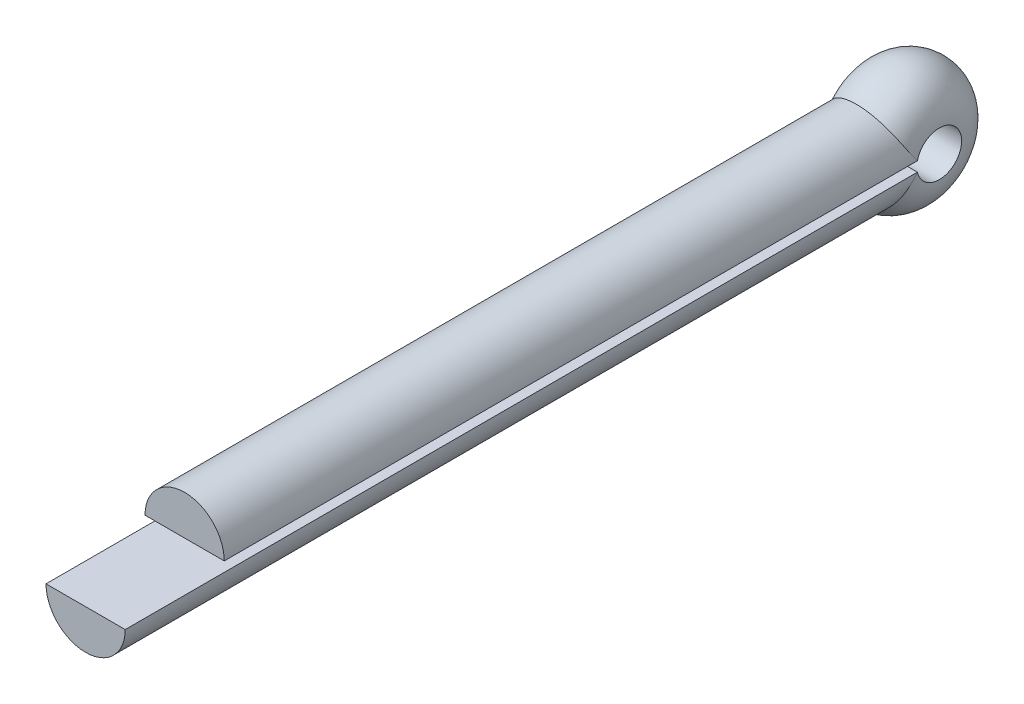
ISO-10303-21;
HEADER;
FILE_DESCRIPTION(('STEP AP214'),'2;1');
FILE_NAME('part.step','',(''),(''),'','','');
FILE_SCHEMA(('AUTOMOTIVE_DESIGN { 1 0 10303 214 1 1 1 1 }'));
ENDSEC;
DATA;
#1=APPLICATION_CONTEXT('core data for automotive mechanical design processes');
#2=APPLICATION_PROTOCOL_DEFINITION('international standard','automotive_design',2000,#1);
#3=PRODUCT_CONTEXT('',#1,'mechanical');
#4=PRODUCT('Part','Part','',(#3));
#5=PRODUCT_RELATED_PRODUCT_CATEGORY('part','',(#4));
#6=PRODUCT_DEFINITION_FORMATION('','',#4);
#7=PRODUCT_DEFINITION_CONTEXT('part definition',#1,'design');
#8=PRODUCT_DEFINITION('design','',#6,#7);
#9=PRODUCT_DEFINITION_SHAPE('','',#8);
#10=(LENGTH_UNIT() NAMED_UNIT(*) SI_UNIT(.MILLI.,.METRE.));
#11=(NAMED_UNIT(*) PLANE_ANGLE_UNIT() SI_UNIT($,.RADIAN.));
#12=(NAMED_UNIT(*) SI_UNIT($,.STERADIAN.) SOLID_ANGLE_UNIT());
#13=UNCERTAINTY_MEASURE_WITH_UNIT(LENGTH_MEASURE(1.E-05),#10,'distance_accuracy_value','');
#14=(GEOMETRIC_REPRESENTATION_CONTEXT(3) GLOBAL_UNCERTAINTY_ASSIGNED_CONTEXT((#13)) GLOBAL_UNIT_ASSIGNED_CONTEXT((#10,
#11,#12)) REPRESENTATION_CONTEXT('',''));
#15=CARTESIAN_POINT('',(0.,0.,0.));
#16=DIRECTION('',(0.,0.,1.));
#17=DIRECTION('',(1.,0.,0.));
#18=AXIS2_PLACEMENT_3D('',#15,#16,#17);
#19=CARTESIAN_POINT('',(2.,0.499999999999996,-5.));
#20=DIRECTION('',(0.,0.,-1.));
#21=DIRECTION('',(1.,0.,0.));
#22=AXIS2_PLACEMENT_3D('',#19,#20,#21);
#23=PLANE('',#22);
#24=CARTESIAN_POINT('',(2.,0.499999999999996,-5.));
#25=DIRECTION('',(0.,0.,-1.));
#26=DIRECTION('',(1.,0.,0.));
#27=AXIS2_PLACEMENT_3D('',#24,#25,#26);
#28=CIRCLE('',#27,2.);
#29=CARTESIAN_POINT('',(0.,0.499999999999996,-5.));
#30=VERTEX_POINT('',#29);
#31=CARTESIAN_POINT('',(4.,0.499999999999995,-5.));
#32=VERTEX_POINT('',#31);
#33=EDGE_CURVE('E79',#30,#32,#28,.T.);
#34=ORIENTED_EDGE('',*,*,#33,.F.);
#35=DIRECTION('',(-1.,0.,0.));
#36=VECTOR('',#35,1.);
#37=CARTESIAN_POINT('',(0.,0.499999999999996,-5.));
#38=LINE('',#37,#36);
#39=EDGE_CURVE('E85',#32,#30,#38,.T.);
#40=ORIENTED_EDGE('',*,*,#39,.F.);
#41=EDGE_LOOP('',(#34,#40));
#42=FACE_BOUND('',#41,.T.);
#43=ADVANCED_FACE('F39',(#42),#23,.F.);
#44=CARTESIAN_POINT('',(2.,0.,0.));
#45=DIRECTION('',(0.,0.,1.));
#46=DIRECTION('',(1.,0.,0.));
#47=AXIS2_PLACEMENT_3D('',#44,#45,#46);
#48=PLANE('',#47);
#49=CARTESIAN_POINT('',(2.,0.,0.));
#50=DIRECTION('',(0.,0.,1.));
#51=DIRECTION('',(1.,0.,0.));
#52=AXIS2_PLACEMENT_3D('',#49,#50,#51);
#53=CIRCLE('',#52,2.);
#54=CARTESIAN_POINT('',(0.,0.,0.));
#55=VERTEX_POINT('',#54);
#56=CARTESIAN_POINT('',(4.,0.,0.));
#57=VERTEX_POINT('',#56);
#58=EDGE_CURVE('E201',#55,#57,#53,.T.);
#59=ORIENTED_EDGE('',*,*,#58,.T.);
#60=DIRECTION('',(-1.,0.,0.));
#61=VECTOR('',#60,1.);
#62=CARTESIAN_POINT('',(0.,0.,0.));
#63=LINE('',#62,#61);
#64=EDGE_CURVE('E165',#57,#55,#63,.T.);
#65=ORIENTED_EDGE('',*,*,#64,.T.);
#66=EDGE_LOOP('',(#59,#65));
#67=FACE_BOUND('',#66,.T.);
#68=ADVANCED_FACE('F230',(#67),#48,.T.);
#69=CARTESIAN_POINT('',(0.,0.5,-40.));
#70=DIRECTION('',(0.,1.,0.));
#71=DIRECTION('',(-1.,0.,0.));
#72=AXIS2_PLACEMENT_3D('',#69,#70,#71);
#73=PLANE('',#72);
#74=ORIENTED_EDGE('',*,*,#39,.T.);
#75=DIRECTION('',(0.,0.,1.));
#76=VECTOR('',#75,1.);
#77=CARTESIAN_POINT('',(0.,0.5,-40.));
#78=LINE('',#77,#76);
#79=CARTESIAN_POINT('',(0.,0.500000000000001,-40.));
#80=VERTEX_POINT('',#79);
#81=EDGE_CURVE('E42',#80,#30,#78,.T.);
#82=ORIENTED_EDGE('',*,*,#81,.F.);
#83=DIRECTION('',(-1.,0.,0.));
#84=VECTOR('',#83,1.);
#85=CARTESIAN_POINT('',(0.,0.500000000000001,-40.));
#86=LINE('',#85,#84);
#87=CARTESIAN_POINT('',(4.,0.5,-40.));
#88=VERTEX_POINT('',#87);
#89=EDGE_CURVE('E316',#88,#80,#86,.T.);
#90=ORIENTED_EDGE('',*,*,#89,.F.);
#91=DIRECTION('',(0.,0.,1.));
#92=VECTOR('',#91,1.);
#93=CARTESIAN_POINT('',(4.,0.5,-40.));
#94=LINE('',#93,#92);
#95=EDGE_CURVE('E90',#88,#32,#94,.T.);
#96=ORIENTED_EDGE('',*,*,#95,.T.);
#97=EDGE_LOOP('',(#74,#82,#90,#96));
#98=FACE_BOUND('',#97,.T.);
#99=ADVANCED_FACE('F86',(#98),#73,.F.);
#100=CARTESIAN_POINT('',(2.,0.5,-40.));
#101=DIRECTION('',(0.,0.,1.));
#102=DIRECTION('',(0.,-1.,0.));
#103=AXIS2_PLACEMENT_3D('',#100,#101,#102);
#104=CYLINDRICAL_SURFACE('',#103,2.);
#105=CARTESIAN_POINT('',(4.00000000000001,0.5,-40.));
#106=CARTESIAN_POINT('',(4.00000001737641,0.50235930064121,-39.998116277382));
#107=CARTESIAN_POINT('',(3.99999584125193,0.50472100075454,-39.9962354554166));
#108=CARTESIAN_POINT('',(3.99979768909097,0.560549155961569,-39.9518874320501));
#109=CARTESIAN_POINT('',(3.99745230429938,0.615220670388856,-39.9108959064395));
#110=CARTESIAN_POINT('',(3.9879566197522,0.726123313404272,-39.8316156157743));
#111=CARTESIAN_POINT('',(3.98080282014764,0.782355549376291,-39.7933288418458));
#112=CARTESIAN_POINT('',(3.96130149805432,0.895739980505567,-39.7192029156661));
#113=CARTESIAN_POINT('',(3.94894164767086,0.952894047573682,-39.6833698093758));
#114=CARTESIAN_POINT('',(3.91878424346007,1.06725125484974,-39.6141431120719));
#115=CARTESIAN_POINT('',(3.90098471330889,1.12445440534574,-39.5807504131709));
#116=CARTESIAN_POINT('',(3.83940415985507,1.29434980457497,-39.4845398723859));
#117=CARTESIAN_POINT('',(3.78730959248784,1.40614429404178,-39.425171394803));
#118=CARTESIAN_POINT('',(3.66082098556796,1.62126674112721,-39.3158838961426));
#119=CARTESIAN_POINT('',(3.58645210283804,1.72460408356439,-39.2659543179089));
#120=CARTESIAN_POINT('',(3.42470682034057,1.90846708329025,-39.1799803398445));
#121=CARTESIAN_POINT('',(3.33918689553033,1.99022093684487,-39.1430758506448));
#122=CARTESIAN_POINT('',(3.15304685574089,2.1384802230446,-39.0775973535078));
#123=CARTESIAN_POINT('',(3.05243404332565,2.2049929908354,-39.0490193364461));
#124=CARTESIAN_POINT('',(2.84863112361413,2.31439070393815,-39.0026953723288));
#125=CARTESIAN_POINT('',(2.74644361944173,2.35883785380443,-38.9842184694793));
#126=CARTESIAN_POINT('',(2.5351334438754,2.43029928304946,-38.9547426741426));
#127=CARTESIAN_POINT('',(2.42601351356411,2.45732040613385,-38.943740845886));
#128=CARTESIAN_POINT('',(2.21034416837075,2.49174088821883,-38.9297600702808));
#129=CARTESIAN_POINT('',(2.10397712352208,2.50012641500501,-38.9263777648115));
#130=CARTESIAN_POINT('',(1.89127468338918,2.49987076704076,-38.9264809355655));
#131=CARTESIAN_POINT('',(1.78493928575903,2.49123227671846,-38.9299653290149));
#132=CARTESIAN_POINT('',(1.5773876413178,2.45761272176371,-38.9436234777712));
#133=CARTESIAN_POINT('',(1.4761129119125,2.43293939697734,-38.9536712865548));
#134=CARTESIAN_POINT('',(1.27937531342037,2.36853274454427,-38.9802051628562));
#135=CARTESIAN_POINT('',(1.18391257411817,2.3287990807358,-38.9966913740858));
#136=CARTESIAN_POINT('',(0.999839654507179,2.23508173972658,-39.0362145539767));
#137=CARTESIAN_POINT('',(0.911356881738371,2.18088904991368,-39.059348023874));
#138=CARTESIAN_POINT('',(0.744980894110577,2.06059940146542,-39.1118210939124));
#139=CARTESIAN_POINT('',(0.667089021883104,1.99450093597357,-39.1411614797148));
#140=CARTESIAN_POINT('',(0.520128044506417,1.8494880821334,-39.2073034726506));
#141=CARTESIAN_POINT('',(0.451630742007957,1.77012354760715,-39.2443865498242));
#142=CARTESIAN_POINT('',(0.329012712335361,1.6038485326822,-39.3248658241418));
#143=CARTESIAN_POINT('',(0.274898012913261,1.5169349086413,-39.3682646564654));
#144=CARTESIAN_POINT('',(0.178080187596662,1.33203531102402,-39.4646629855028));
#145=CARTESIAN_POINT('',(0.136507639193982,1.2337050036898,-39.5181335941322));
#146=CARTESIAN_POINT('',(0.0702321611518915,1.0356164973431,-39.6322644950388));
#147=CARTESIAN_POINT('',(0.045521862333216,0.935858941555514,-39.6929216330228));
#148=CARTESIAN_POINT('',(0.0190094035303274,0.781001745205527,-39.7942450184742));
#149=CARTESIAN_POINT('',(0.011929277766039,0.725058192084822,-39.832359331009));
#150=CARTESIAN_POINT('',(0.00252680266914988,0.614705956510285,-39.9112818101794));
#151=CARTESIAN_POINT('',(0.000201466379390633,0.560296331645478,-39.9520882689657));
#152=CARTESIAN_POINT('',(4.15638390274853E-06,0.504720995921473,-39.9962354591642));
#153=CARTESIAN_POINT('',(-1.98468955667651E-08,0.502359295584557,-39.9981162813077));
#154=CARTESIAN_POINT('',(0.,0.5,-40.));
#155=B_SPLINE_CURVE_WITH_KNOTS('',3,(#105,#106,#107,#108,#109,#110,#111,#112,#113,#114,#115,
#116,#117,#118,#119,#120,#121,#122,#123,#124,#125,#126,#127,#128,#129,#130,#131,#132,#133,#134,
#135,#136,#137,#138,#139,#140,#141,#142,#143,#144,#145,#146,#147,#148,#149,#150,#151,#152,#153,
#154),.UNSPECIFIED.,.F.,.F.,(4,2,2,2,2,2,2,2,2,2,2,2,2,2,2,2,2,2,2,2,2,2,2,2,4),(0.,
0.00905736093527155,0.213892864780105,0.418877621713576,0.624350534619698,0.829898188094256,
1.23810627378972,1.64585505283405,2.0156291416422,2.3852248920804,2.72235720223247,
3.05935702999864,3.37805014307371,3.69669300712119,4.00939421095024,4.32210239499274,
4.63960194009876,4.95714169786017,5.28931084100856,5.62161897757761,5.97834293671379,
6.33491089951004,6.53890553714988,6.74277198600725,6.75182934694362),.UNSPECIFIED.);
#156=EDGE_CURVE('E100',#88,#80,#155,.T.);
#157=ORIENTED_EDGE('',*,*,#156,.T.);
#158=ORIENTED_EDGE('',*,*,#81,.T.);
#159=ORIENTED_EDGE('',*,*,#33,.T.);
#160=ORIENTED_EDGE('',*,*,#95,.F.);
#161=EDGE_LOOP('',(#157,#158,#159,#160));
#162=FACE_BOUND('',#161,.T.);
#163=ADVANCED_FACE('F99',(#162),#104,.T.);
#164=CARTESIAN_POINT('',(0.,0.25,-41.1012581554896));
#165=DIRECTION('',(1.,0.,0.));
#166=DIRECTION('',(0.,0.,-1.));
#167=AXIS2_PLACEMENT_3D('',#164,#165,#166);
#168=CYLINDRICAL_SURFACE('',#167,1.12927832044737);
#169=ORIENTED_EDGE('',*,*,#89,.T.);
#170=CARTESIAN_POINT('',(0.,0.25,-41.1012581554896));
#171=DIRECTION('',(1.,0.,0.));
#172=DIRECTION('',(0.,-0.221380323586626,0.975187547258824));
#173=AXIS2_PLACEMENT_3D('',#170,#171,#172);
#174=CIRCLE('',#173,1.12927832044737);
#175=CARTESIAN_POINT('',(0.,0.,-40.));
#176=VERTEX_POINT('',#175);
#177=EDGE_CURVE('E94',#176,#80,#174,.T.);
#178=ORIENTED_EDGE('',*,*,#177,.F.);
#179=DIRECTION('',(-1.,0.,0.));
#180=VECTOR('',#179,1.);
#181=CARTESIAN_POINT('',(0.,0.,-40.));
#182=LINE('',#181,#180);
#183=CARTESIAN_POINT('',(4.,0.,-40.));
#184=VERTEX_POINT('',#183);
#185=EDGE_CURVE('E50',#184,#176,#182,.T.);
#186=ORIENTED_EDGE('',*,*,#185,.F.);
#187=CARTESIAN_POINT('',(4.,0.25,-41.1012581554896));
#188=DIRECTION('',(1.,0.,0.));
#189=DIRECTION('',(0.,-0.221380323586625,0.975187547258824));
#190=AXIS2_PLACEMENT_3D('',#187,#188,#189);
#191=CIRCLE('',#190,1.12927832044737);
#192=EDGE_CURVE('E318',#184,#88,#191,.T.);
#193=ORIENTED_EDGE('',*,*,#192,.T.);
#194=EDGE_LOOP('',(#169,#178,#186,#193));
#195=FACE_BOUND('',#194,.T.);
#196=ADVANCED_FACE('F122',(#195),#168,.F.);
#197=CARTESIAN_POINT('',(2.,0.25,-41.1012581554896));
#198=DIRECTION('',(1.,0.,0.));
#199=DIRECTION('',(0.,0.,-1.));
#200=AXIS2_PLACEMENT_3D('',#197,#198,#199);
#201=DEGENERATE_TOROIDAL_SURFACE('',#200,1.12927832044737,2.,.T.);
#202=ORIENTED_EDGE('',*,*,#192,.F.);
#203=CARTESIAN_POINT('',(4.00000000000001,0.,-40.));
#204=CARTESIAN_POINT('',(4.00000001737641,-0.00235930064120968,-39.998116277382));
#205=CARTESIAN_POINT('',(3.99999584125193,-0.00472100075453965,-39.9962354554166));
#206=CARTESIAN_POINT('',(3.99979768909097,-0.0605491559615672,-39.9518874320501));
#207=CARTESIAN_POINT('',(3.99745230429938,-0.115220670388857,-39.9108959064395));
#208=CARTESIAN_POINT('',(3.9879566197522,-0.226123313404271,-39.8316156157743));
#209=CARTESIAN_POINT('',(3.98080282014764,-0.282355549376287,-39.7933288418458));
#210=CARTESIAN_POINT('',(3.96130149805432,-0.395739980505562,-39.7192029156661));
#211=CARTESIAN_POINT('',(3.94894164767086,-0.452894047573681,-39.6833698093758));
#212=CARTESIAN_POINT('',(3.91878424346007,-0.567251254849738,-39.6141431120719));
#213=CARTESIAN_POINT('',(3.90098471330889,-0.624454405345737,-39.5807504131709));
#214=CARTESIAN_POINT('',(3.83940415985507,-0.79434980457497,-39.4845398723859));
#215=CARTESIAN_POINT('',(3.78730959248784,-0.906144294041772,-39.425171394803));
#216=CARTESIAN_POINT('',(3.66082098556797,-1.1212667411272,-39.3158838961426));
#217=CARTESIAN_POINT('',(3.58645210283805,-1.22460408356438,-39.2659543179089));
#218=CARTESIAN_POINT('',(3.42470682034058,-1.40846708329025,-39.1799803398445));
#219=CARTESIAN_POINT('',(3.33918689553034,-1.49022093684486,-39.1430758506448));
#220=CARTESIAN_POINT('',(3.15304685574089,-1.63848022304459,-39.0775973535078));
#221=CARTESIAN_POINT('',(3.05243404332565,-1.70499299083539,-39.0490193364462));
#222=CARTESIAN_POINT('',(2.84863112361413,-1.81439070393814,-39.0026953723288));
#223=CARTESIAN_POINT('',(2.74644361944173,-1.85883785380443,-38.9842184694793));
#224=CARTESIAN_POINT('',(2.5351334438754,-1.93029928304946,-38.9547426741426));
#225=CARTESIAN_POINT('',(2.42601351356412,-1.95732040613385,-38.943740845886));
#226=CARTESIAN_POINT('',(2.21034416837076,-1.99174088821883,-38.9297600702808));
#227=CARTESIAN_POINT('',(2.10397712352208,-2.00012641500501,-38.9263777648115));
#228=CARTESIAN_POINT('',(1.89127468338918,-1.99987076704076,-38.9264809355655));
#229=CARTESIAN_POINT('',(1.78493928575904,-1.99123227671846,-38.929965329015));
#230=CARTESIAN_POINT('',(1.57738764131781,-1.95761272176371,-38.9436234777712));
#231=CARTESIAN_POINT('',(1.4761129119125,-1.93293939697734,-38.9536712865548));
#232=CARTESIAN_POINT('',(1.27937531342038,-1.86853274454427,-38.9802051628562));
#233=CARTESIAN_POINT('',(1.18391257411818,-1.8287990807358,-38.9966913740858));
#234=CARTESIAN_POINT('',(0.999839654507183,-1.73508173972658,-39.0362145539767));
#235=CARTESIAN_POINT('',(0.911356881738374,-1.68088904991368,-39.059348023874));
#236=CARTESIAN_POINT('',(0.74498089411058,-1.56059940146542,-39.1118210939124));
#237=CARTESIAN_POINT('',(0.667089021883109,-1.49450093597357,-39.1411614797148));
#238=CARTESIAN_POINT('',(0.520128044506421,-1.3494880821334,-39.2073034726506));
#239=CARTESIAN_POINT('',(0.451630742007959,-1.27012354760715,-39.2443865498242));
#240=CARTESIAN_POINT('',(0.329012712335362,-1.1038485326822,-39.3248658241418));
#241=CARTESIAN_POINT('',(0.274898012913263,-1.0169349086413,-39.3682646564654));
#242=CARTESIAN_POINT('',(0.178080187596666,-0.832035311024024,-39.4646629855028));
#243=CARTESIAN_POINT('',(0.136507639193987,-0.733705003689817,-39.5181335941322));
#244=CARTESIAN_POINT('',(0.0702321611518947,-0.535616497343108,-39.6322644950388));
#245=CARTESIAN_POINT('',(0.0455218623332179,-0.435858941555511,-39.6929216330228));
#246=CARTESIAN_POINT('',(0.0190094035303281,-0.281001745205539,-39.7942450184742));
#247=CARTESIAN_POINT('',(0.0119292777660396,-0.225058192084846,-39.832359331009));
#248=CARTESIAN_POINT('',(0.00252680266914915,-0.114705956510269,-39.9112818101793));
#249=CARTESIAN_POINT('',(0.000201466379388547,-0.0602963316454082,-39.9520882689656));
#250=CARTESIAN_POINT('',(4.15638390286887E-06,-0.00472099592146876,-39.9962354591641));
#251=CARTESIAN_POINT('',(-1.98468953455304E-08,-0.00235929558455404,-39.9981162813077));
#252=CARTESIAN_POINT('',(0.,0.,-40.));
#253=B_SPLINE_CURVE_WITH_KNOTS('',3,(#203,#204,#205,#206,#207,#208,#209,#210,#211,#212,#213,
#214,#215,#216,#217,#218,#219,#220,#221,#222,#223,#224,#225,#226,#227,#228,#229,#230,#231,#232,
#233,#234,#235,#236,#237,#238,#239,#240,#241,#242,#243,#244,#245,#246,#247,#248,#249,#250,#251,
#252),.UNSPECIFIED.,.F.,.F.,(4,2,2,2,2,2,2,2,2,2,2,2,2,2,2,2,2,2,2,2,2,2,2,2,4),(0.,
0.00905736093527152,0.213892864780101,0.418877621713572,0.624350534619704,0.829898188094256,
1.23810627378971,1.64585505283404,2.01562914164219,2.38522489208039,2.72235720223246,
3.05935702999863,3.3780501430737,3.69669300712118,4.00939421095024,4.32210239499273,
4.63960194009876,4.95714169786016,5.28931084100856,5.6216189775776,5.97834293671378,
6.33491089951003,6.53890553714987,6.74277198600725,6.75182934694362),.UNSPECIFIED.);
#254=EDGE_CURVE('E11',#184,#176,#253,.T.);
#255=ORIENTED_EDGE('',*,*,#254,.T.);
#256=ORIENTED_EDGE('',*,*,#177,.T.);
#257=ORIENTED_EDGE('',*,*,#156,.F.);
#258=EDGE_LOOP('',(#202,#255,#256,#257));
#259=FACE_BOUND('',#258,.T.);
#260=ADVANCED_FACE('F190',(#259),#201,.T.);
#261=CARTESIAN_POINT('',(0.,0.,0.));
#262=DIRECTION('',(0.,-1.,0.));
#263=DIRECTION('',(1.,0.,0.));
#264=AXIS2_PLACEMENT_3D('',#261,#262,#263);
#265=PLANE('',#264);
#266=ORIENTED_EDGE('',*,*,#185,.T.);
#267=DIRECTION('',(0.,0.,-1.));
#268=VECTOR('',#267,1.);
#269=CARTESIAN_POINT('',(0.,0.,0.));
#270=LINE('',#269,#268);
#271=EDGE_CURVE('E160',#55,#176,#270,.T.);
#272=ORIENTED_EDGE('',*,*,#271,.F.);
#273=ORIENTED_EDGE('',*,*,#64,.F.);
#274=DIRECTION('',(0.,0.,-1.));
#275=VECTOR('',#274,1.);
#276=CARTESIAN_POINT('',(4.,0.,0.));
#277=LINE('',#276,#275);
#278=EDGE_CURVE('E164',#57,#184,#277,.T.);
#279=ORIENTED_EDGE('',*,*,#278,.T.);
#280=EDGE_LOOP('',(#266,#272,#273,#279));
#281=FACE_BOUND('',#280,.T.);
#282=ADVANCED_FACE('F180',(#281),#265,.F.);
#283=CARTESIAN_POINT('',(2.,0.,0.));
#284=DIRECTION('',(0.,0.,-1.));
#285=DIRECTION('',(-1.,0.,0.));
#286=AXIS2_PLACEMENT_3D('',#283,#284,#285);
#287=CYLINDRICAL_SURFACE('',#286,2.);
#288=ORIENTED_EDGE('',*,*,#278,.F.);
#289=ORIENTED_EDGE('',*,*,#58,.F.);
#290=ORIENTED_EDGE('',*,*,#271,.T.);
#291=ORIENTED_EDGE('',*,*,#254,.F.);
#292=EDGE_LOOP('',(#288,#289,#290,#291));
#293=FACE_BOUND('',#292,.T.);
#294=ADVANCED_FACE('F189',(#293),#287,.T.);
#295=CLOSED_SHELL('',(#43,#68,#99,#163,#196,#260,#282,#294));
#296=MANIFOLD_SOLID_BREP('B2',#295);
#297=ADVANCED_BREP_SHAPE_REPRESENTATION('',(#18,#296),#14);
#298=SHAPE_DEFINITION_REPRESENTATION(#9,#297);
ENDSEC;
END-ISO-10303-21;
